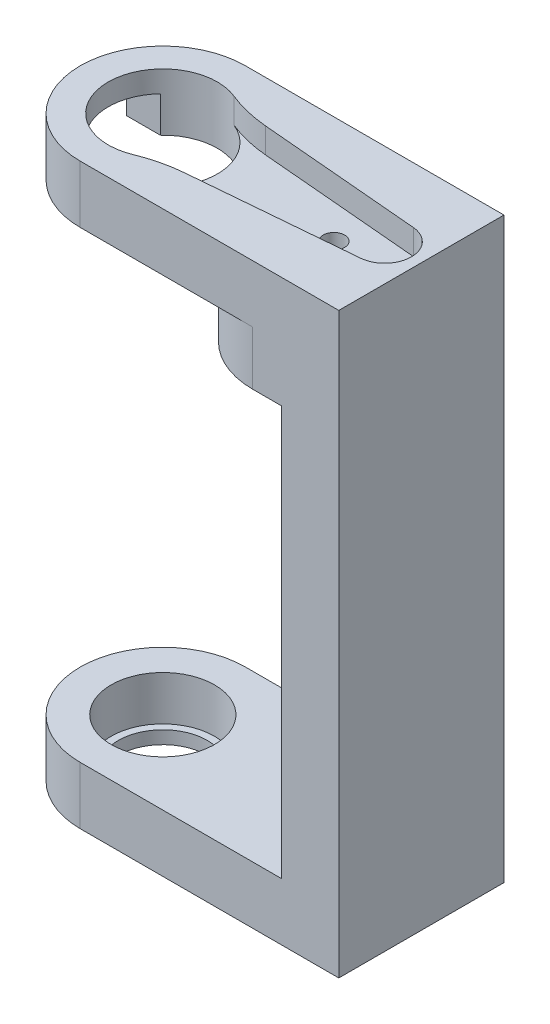
ISO-10303-21;
HEADER;
FILE_DESCRIPTION(('STEP AP214'),'2;1');
FILE_NAME('part.step','',(''),(''),'','','');
FILE_SCHEMA(('AUTOMOTIVE_DESIGN { 1 0 10303 214 1 1 1 1 }'));
ENDSEC;
DATA;
#1=APPLICATION_CONTEXT('core data for automotive mechanical design processes');
#2=APPLICATION_PROTOCOL_DEFINITION('international standard','automotive_design',2000,#1);
#3=PRODUCT_CONTEXT('',#1,'mechanical');
#4=PRODUCT('Part','Part','',(#3));
#5=PRODUCT_RELATED_PRODUCT_CATEGORY('part','',(#4));
#6=PRODUCT_DEFINITION_FORMATION('','',#4);
#7=PRODUCT_DEFINITION_CONTEXT('part definition',#1,'design');
#8=PRODUCT_DEFINITION('design','',#6,#7);
#9=PRODUCT_DEFINITION_SHAPE('','',#8);
#10=(LENGTH_UNIT() NAMED_UNIT(*) SI_UNIT(.MILLI.,.METRE.));
#11=(NAMED_UNIT(*) PLANE_ANGLE_UNIT() SI_UNIT($,.RADIAN.));
#12=(NAMED_UNIT(*) SI_UNIT($,.STERADIAN.) SOLID_ANGLE_UNIT());
#13=UNCERTAINTY_MEASURE_WITH_UNIT(LENGTH_MEASURE(1.E-05),#10,'distance_accuracy_value','');
#14=(GEOMETRIC_REPRESENTATION_CONTEXT(3) GLOBAL_UNCERTAINTY_ASSIGNED_CONTEXT((#13)) GLOBAL_UNIT_ASSIGNED_CONTEXT((#10,
#11,#12)) REPRESENTATION_CONTEXT('',''));
#15=CARTESIAN_POINT('',(0.,0.,0.));
#16=DIRECTION('',(0.,0.,1.));
#17=DIRECTION('',(1.,0.,0.));
#18=AXIS2_PLACEMENT_3D('',#15,#16,#17);
#19=CARTESIAN_POINT('',(0.,-38.5,0.));
#20=DIRECTION('',(0.,1.,0.));
#21=DIRECTION('',(0.,0.,1.));
#22=AXIS2_PLACEMENT_3D('',#19,#20,#21);
#23=CYLINDRICAL_SURFACE('',#22,3.6);
#24=CARTESIAN_POINT('',(0.,-34.5,0.));
#25=DIRECTION('',(0.,-1.,0.));
#26=DIRECTION('',(0.,0.,-1.));
#27=AXIS2_PLACEMENT_3D('',#24,#25,#26);
#28=CIRCLE('',#27,3.6);
#29=CARTESIAN_POINT('',(0.,-34.5,-3.6));
#30=VERTEX_POINT('',#29);
#31=EDGE_CURVE('E226',#30,#30,#28,.T.);
#32=ORIENTED_EDGE('',*,*,#31,.F.);
#33=EDGE_LOOP('',(#32));
#34=FACE_BOUND('',#33,.T.);
#35=CARTESIAN_POINT('',(0.,-37.6,0.));
#36=DIRECTION('',(0.,-1.,0.));
#37=DIRECTION('',(0.,0.,-1.));
#38=AXIS2_PLACEMENT_3D('',#35,#36,#37);
#39=CIRCLE('',#38,3.6);
#40=CARTESIAN_POINT('',(0.,-37.6,-3.6));
#41=VERTEX_POINT('',#40);
#42=EDGE_CURVE('E692',#41,#41,#39,.T.);
#43=ORIENTED_EDGE('',*,*,#42,.T.);
#44=EDGE_LOOP('',(#43));
#45=FACE_BOUND('',#44,.T.);
#46=ADVANCED_FACE('F43',(#34,#45),#23,.F.);
#47=CARTESIAN_POINT('',(12.,-8.,0.));
#48=DIRECTION('',(0.,1.,0.));
#49=DIRECTION('',(0.,0.,1.));
#50=AXIS2_PLACEMENT_3D('',#47,#48,#49);
#51=CYLINDRICAL_SURFACE('',#50,5.75);
#52=DIRECTION('',(0.,-1.,0.));
#53=VECTOR('',#52,1.);
#54=CARTESIAN_POINT('',(12.,-8.,-5.75));
#55=LINE('',#54,#53);
#56=CARTESIAN_POINT('',(12.,-6.,-5.75));
#57=VERTEX_POINT('',#56);
#58=CARTESIAN_POINT('',(12.,-2.25,-5.75));
#59=VERTEX_POINT('',#58);
#60=EDGE_CURVE('E347',#57,#59,#55,.F.);
#61=ORIENTED_EDGE('',*,*,#60,.F.);
#62=CARTESIAN_POINT('',(12.,-6.,0.));
#63=DIRECTION('',(0.,-1.,0.));
#64=DIRECTION('',(0.,0.,-1.));
#65=AXIS2_PLACEMENT_3D('',#62,#63,#64);
#66=CIRCLE('',#65,5.75);
#67=CARTESIAN_POINT('',(12.,-6.,5.75));
#68=VERTEX_POINT('',#67);
#69=EDGE_CURVE('E368',#57,#68,#66,.F.);
#70=ORIENTED_EDGE('',*,*,#69,.T.);
#71=DIRECTION('',(0.,-1.,0.));
#72=VECTOR('',#71,1.);
#73=CARTESIAN_POINT('',(12.,-8.,5.75));
#74=LINE('',#73,#72);
#75=CARTESIAN_POINT('',(12.,-2.25,5.75));
#76=VERTEX_POINT('',#75);
#77=EDGE_CURVE('E349',#76,#68,#74,.T.);
#78=ORIENTED_EDGE('',*,*,#77,.F.);
#79=CARTESIAN_POINT('',(12.,-2.25,0.));
#80=DIRECTION('',(0.,1.,0.));
#81=DIRECTION('',(0.,0.,1.));
#82=AXIS2_PLACEMENT_3D('',#79,#80,#81);
#83=CIRCLE('',#82,5.75);
#84=EDGE_CURVE('E351',#59,#76,#83,.T.);
#85=ORIENTED_EDGE('',*,*,#84,.F.);
#86=EDGE_LOOP('',(#61,#70,#78,#85));
#87=FACE_BOUND('',#86,.T.);
#88=ADVANCED_FACE('F396',(#87),#51,.T.);
#89=CARTESIAN_POINT('',(0.,0.,0.));
#90=DIRECTION('',(0.,1.,0.));
#91=DIRECTION('',(0.,0.,1.));
#92=AXIS2_PLACEMENT_3D('',#89,#90,#91);
#93=PLANE('',#92);
#94=CARTESIAN_POINT('',(11.91,0.,0.));
#95=DIRECTION('',(0.,1.,0.));
#96=DIRECTION('',(0.,0.,1.));
#97=AXIS2_PLACEMENT_3D('',#94,#95,#96);
#98=CIRCLE('',#97,0.75);
#99=CARTESIAN_POINT('',(11.91,0.,0.750000000000001));
#100=VERTEX_POINT('',#99);
#101=EDGE_CURVE('E244',#100,#100,#98,.T.);
#102=ORIENTED_EDGE('',*,*,#101,.F.);
#103=EDGE_LOOP('',(#102));
#104=FACE_BOUND('',#103,.T.);
#105=CARTESIAN_POINT('',(15.4500000000002,0.,0.));
#106=DIRECTION('',(0.,1.,0.));
#107=DIRECTION('',(0.,0.,1.));
#108=AXIS2_PLACEMENT_3D('',#105,#106,#107);
#109=CIRCLE('',#108,1.85);
#110=CARTESIAN_POINT('',(15.6102275035648,0.,1.84304833010455));
#111=VERTEX_POINT('',#110);
#112=CARTESIAN_POINT('',(15.6102275035648,0.,-1.84304833010471));
#113=VERTEX_POINT('',#112);
#114=EDGE_CURVE('E267',#111,#113,#109,.T.);
#115=ORIENTED_EDGE('',*,*,#114,.T.);
#116=DIRECTION('',(-0.996242340597094,0.,-0.0866094613862879));
#117=VECTOR('',#116,1.);
#118=CARTESIAN_POINT('',(0.276121025049715,0.,-3.17613632368286));
#119=LINE('',#118,#117);
#120=CARTESIAN_POINT('',(4.32454293124207,0.,-2.82418215904696));
#121=VERTEX_POINT('',#120);
#122=EDGE_CURVE('E272',#113,#121,#119,.T.);
#123=ORIENTED_EDGE('',*,*,#122,.T.);
#124=CARTESIAN_POINT('',(5.19063754510495,0.,-12.7866055650179));
#125=DIRECTION('',(0.,1.,0.));
#126=DIRECTION('',(0.,0.,1.));
#127=AXIS2_PLACEMENT_3D('',#124,#125,#126);
#128=CIRCLE('',#127,10.);
#129=CARTESIAN_POINT('',(1.42930599068107,0.,-3.52094935848319));
#130=VERTEX_POINT('',#129);
#131=EDGE_CURVE('E335',#121,#130,#128,.F.);
#132=ORIENTED_EDGE('',*,*,#131,.T.);
#133=CARTESIAN_POINT('',(0.,0.,0.));
#134=DIRECTION('',(0.,1.,0.));
#135=DIRECTION('',(0.,0.,1.));
#136=AXIS2_PLACEMENT_3D('',#133,#134,#135);
#137=CIRCLE('',#136,3.8);
#138=CARTESIAN_POINT('',(1.42930599068122,0.,3.52094935848313));
#139=VERTEX_POINT('',#138);
#140=EDGE_CURVE('E310',#139,#130,#137,.T.);
#141=ORIENTED_EDGE('',*,*,#140,.F.);
#142=CARTESIAN_POINT('',(5.19063754510547,0.,12.7866055650177));
#143=DIRECTION('',(0.,1.,0.));
#144=DIRECTION('',(0.,0.,1.));
#145=AXIS2_PLACEMENT_3D('',#142,#143,#144);
#146=CIRCLE('',#145,10.);
#147=CARTESIAN_POINT('',(4.32454293124259,0.,2.82418215904675));
#148=VERTEX_POINT('',#147);
#149=EDGE_CURVE('E333',#139,#148,#146,.F.);
#150=ORIENTED_EDGE('',*,*,#149,.T.);
#151=DIRECTION('',(0.996242340597094,0.,-0.0866094613862878));
#152=VECTOR('',#151,1.);
#153=CARTESIAN_POINT('',(0.276121025049701,0.,3.1761363236827));
#154=LINE('',#153,#152);
#155=EDGE_CURVE('E292',#148,#111,#154,.T.);
#156=ORIENTED_EDGE('',*,*,#155,.T.);
#157=EDGE_LOOP('',(#115,#123,#132,#141,#150,#156));
#158=FACE_BOUND('',#157,.T.);
#159=ADVANCED_FACE('F445',(#104,#158),#93,.T.);
#160=CARTESIAN_POINT('',(0.,-2.25,0.));
#161=DIRECTION('',(0.,1.,0.));
#162=DIRECTION('',(0.,0.,1.));
#163=AXIS2_PLACEMENT_3D('',#160,#161,#162);
#164=PLANE('',#163);
#165=CARTESIAN_POINT('',(0.,-2.25,0.));
#166=DIRECTION('',(0.,1.,0.));
#167=DIRECTION('',(0.,0.,1.));
#168=AXIS2_PLACEMENT_3D('',#165,#166,#167);
#169=CIRCLE('',#168,3.8);
#170=CARTESIAN_POINT('',(-2.7712812921102,-2.25,2.6));
#171=VERTEX_POINT('',#170);
#172=CARTESIAN_POINT('',(-2.7712812921102,-2.25,-2.6));
#173=VERTEX_POINT('',#172);
#174=EDGE_CURVE('E311',#171,#173,#169,.T.);
#175=ORIENTED_EDGE('',*,*,#174,.T.);
#176=DIRECTION('',(1.,0.,0.));
#177=VECTOR('',#176,1.);
#178=CARTESIAN_POINT('',(-5.75,-2.25,-2.6));
#179=LINE('',#178,#177);
#180=CARTESIAN_POINT('',(-5.12859629918363,-2.25,-2.6));
#181=VERTEX_POINT('',#180);
#182=EDGE_CURVE('E252',#181,#173,#179,.T.);
#183=ORIENTED_EDGE('',*,*,#182,.F.);
#184=CARTESIAN_POINT('',(0.,-2.25,0.));
#185=DIRECTION('',(0.,1.,0.));
#186=DIRECTION('',(0.,0.,1.));
#187=AXIS2_PLACEMENT_3D('',#184,#185,#186);
#188=CIRCLE('',#187,5.75);
#189=CARTESIAN_POINT('',(0.,-2.25,-5.75));
#190=VERTEX_POINT('',#189);
#191=EDGE_CURVE('E316',#190,#181,#188,.T.);
#192=ORIENTED_EDGE('',*,*,#191,.F.);
#193=DIRECTION('',(1.,0.,0.));
#194=VECTOR('',#193,1.);
#195=CARTESIAN_POINT('',(0.,-2.25,-5.75));
#196=LINE('',#195,#194);
#197=EDGE_CURVE('E300',#190,#59,#196,.T.);
#198=ORIENTED_EDGE('',*,*,#197,.T.);
#199=ORIENTED_EDGE('',*,*,#84,.T.);
#200=DIRECTION('',(-1.,0.,0.));
#201=VECTOR('',#200,1.);
#202=CARTESIAN_POINT('',(18.,-2.25,5.75));
#203=LINE('',#202,#201);
#204=CARTESIAN_POINT('',(0.,-2.25,5.75));
#205=VERTEX_POINT('',#204);
#206=EDGE_CURVE('E303',#76,#205,#203,.T.);
#207=ORIENTED_EDGE('',*,*,#206,.T.);
#208=CARTESIAN_POINT('',(-5.12859629918363,-2.25,2.6));
#209=VERTEX_POINT('',#208);
#210=EDGE_CURVE('E314',#209,#205,#188,.T.);
#211=ORIENTED_EDGE('',*,*,#210,.F.);
#212=DIRECTION('',(1.,0.,0.));
#213=VECTOR('',#212,1.);
#214=CARTESIAN_POINT('',(-5.75,-2.25,2.6));
#215=LINE('',#214,#213);
#216=EDGE_CURVE('E255',#209,#171,#215,.T.);
#217=ORIENTED_EDGE('',*,*,#216,.T.);
#218=EDGE_LOOP('',(#175,#183,#192,#198,#199,#207,#211,#217));
#219=FACE_BOUND('',#218,.T.);
#220=ADVANCED_FACE('F401',(#219),#164,.F.);
#221=CARTESIAN_POINT('',(0.,-2.25,0.));
#222=DIRECTION('',(0.,1.,0.));
#223=DIRECTION('',(0.,0.,1.));
#224=AXIS2_PLACEMENT_3D('',#221,#222,#223);
#225=CYLINDRICAL_SURFACE('',#224,5.75);
#226=DIRECTION('',(0.,1.,0.));
#227=VECTOR('',#226,1.);
#228=CARTESIAN_POINT('',(-5.12859629918363,-2.25,2.6));
#229=LINE('',#228,#227);
#230=CARTESIAN_POINT('',(-5.12859629918363,0.25,2.6));
#231=VERTEX_POINT('',#230);
#232=EDGE_CURVE('E263',#209,#231,#229,.T.);
#233=ORIENTED_EDGE('',*,*,#232,.F.);
#234=ORIENTED_EDGE('',*,*,#210,.T.);
#235=DIRECTION('',(0.,1.,0.));
#236=VECTOR('',#235,1.);
#237=CARTESIAN_POINT('',(0.,-23.6100093632938,5.75));
#238=LINE('',#237,#236);
#239=CARTESIAN_POINT('',(0.,1.75,5.75));
#240=VERTEX_POINT('',#239);
#241=EDGE_CURVE('E204',#205,#240,#238,.T.);
#242=ORIENTED_EDGE('',*,*,#241,.T.);
#243=CARTESIAN_POINT('',(0.,1.75,0.));
#244=DIRECTION('',(0.,1.,0.));
#245=DIRECTION('',(0.,0.,1.));
#246=AXIS2_PLACEMENT_3D('',#243,#244,#245);
#247=CIRCLE('',#246,5.75);
#248=CARTESIAN_POINT('',(0.,1.75,-5.75));
#249=VERTEX_POINT('',#248);
#250=EDGE_CURVE('E283',#249,#240,#247,.T.);
#251=ORIENTED_EDGE('',*,*,#250,.F.);
#252=DIRECTION('',(0.,1.,0.));
#253=VECTOR('',#252,1.);
#254=CARTESIAN_POINT('',(0.,-23.6100093632938,-5.75));
#255=LINE('',#254,#253);
#256=EDGE_CURVE('E304',#190,#249,#255,.T.);
#257=ORIENTED_EDGE('',*,*,#256,.F.);
#258=ORIENTED_EDGE('',*,*,#191,.T.);
#259=DIRECTION('',(0.,1.,0.));
#260=VECTOR('',#259,1.);
#261=CARTESIAN_POINT('',(-5.12859629918363,-2.25,-2.6));
#262=LINE('',#261,#260);
#263=CARTESIAN_POINT('',(-5.12859629918363,0.250000000000001,-2.6));
#264=VERTEX_POINT('',#263);
#265=EDGE_CURVE('E265',#264,#181,#262,.F.);
#266=ORIENTED_EDGE('',*,*,#265,.F.);
#267=CARTESIAN_POINT('',(0.,0.250000000000001,0.));
#268=DIRECTION('',(0.,1.,0.));
#269=DIRECTION('',(0.,0.,1.));
#270=AXIS2_PLACEMENT_3D('',#267,#268,#269);
#271=CIRCLE('',#270,5.75);
#272=EDGE_CURVE('E254',#231,#264,#271,.F.);
#273=ORIENTED_EDGE('',*,*,#272,.F.);
#274=EDGE_LOOP('',(#233,#234,#242,#251,#257,#258,#266,#273));
#275=FACE_BOUND('',#274,.T.);
#276=ADVANCED_FACE('F406',(#275),#225,.T.);
#277=CARTESIAN_POINT('',(0.,-2.25,0.));
#278=DIRECTION('',(0.,1.,0.));
#279=DIRECTION('',(0.,0.,1.));
#280=AXIS2_PLACEMENT_3D('',#277,#278,#279);
#281=CYLINDRICAL_SURFACE('',#280,3.8);
#282=CARTESIAN_POINT('',(0.,0.250000000000001,0.));
#283=DIRECTION('',(0.,1.,0.));
#284=DIRECTION('',(0.,0.,1.));
#285=AXIS2_PLACEMENT_3D('',#282,#283,#284);
#286=CIRCLE('',#285,3.8);
#287=CARTESIAN_POINT('',(-2.7712812921102,0.25,2.6));
#288=VERTEX_POINT('',#287);
#289=CARTESIAN_POINT('',(-2.7712812921102,0.250000000000001,-2.6));
#290=VERTEX_POINT('',#289);
#291=EDGE_CURVE('E338',#288,#290,#286,.F.);
#292=ORIENTED_EDGE('',*,*,#291,.T.);
#293=DIRECTION('',(0.,1.,0.));
#294=VECTOR('',#293,1.);
#295=CARTESIAN_POINT('',(-2.7712812921102,-2.25,-2.6));
#296=LINE('',#295,#294);
#297=EDGE_CURVE('E344',#290,#173,#296,.F.);
#298=ORIENTED_EDGE('',*,*,#297,.T.);
#299=ORIENTED_EDGE('',*,*,#174,.F.);
#300=DIRECTION('',(0.,1.,0.));
#301=VECTOR('',#300,1.);
#302=CARTESIAN_POINT('',(-2.7712812921102,-2.25,2.6));
#303=LINE('',#302,#301);
#304=EDGE_CURVE('E341',#171,#288,#303,.T.);
#305=ORIENTED_EDGE('',*,*,#304,.T.);
#306=EDGE_LOOP('',(#292,#298,#299,#305));
#307=FACE_BOUND('',#306,.T.);
#308=CARTESIAN_POINT('',(0.,1.75,0.));
#309=DIRECTION('',(0.,1.,0.));
#310=DIRECTION('',(0.,0.,1.));
#311=AXIS2_PLACEMENT_3D('',#308,#309,#310);
#312=CIRCLE('',#311,3.8);
#313=CARTESIAN_POINT('',(1.42930599068122,1.75,3.52094935848313));
#314=VERTEX_POINT('',#313);
#315=CARTESIAN_POINT('',(1.42930599068107,1.75,-3.52094935848319));
#316=VERTEX_POINT('',#315);
#317=EDGE_CURVE('E274',#314,#316,#312,.F.);
#318=ORIENTED_EDGE('',*,*,#317,.F.);
#319=DIRECTION('',(0.,1.,0.));
#320=VECTOR('',#319,1.);
#321=CARTESIAN_POINT('',(1.42930599068122,-2.25,3.52094935848313));
#322=LINE('',#321,#320);
#323=EDGE_CURVE('E321',#314,#139,#322,.F.);
#324=ORIENTED_EDGE('',*,*,#323,.T.);
#325=ORIENTED_EDGE('',*,*,#140,.T.);
#326=DIRECTION('',(0.,1.,0.));
#327=VECTOR('',#326,1.);
#328=CARTESIAN_POINT('',(1.42930599068107,-2.25,-3.52094935848319));
#329=LINE('',#328,#327);
#330=EDGE_CURVE('E319',#130,#316,#329,.T.);
#331=ORIENTED_EDGE('',*,*,#330,.T.);
#332=EDGE_LOOP('',(#318,#324,#325,#331));
#333=FACE_BOUND('',#332,.T.);
#334=ADVANCED_FACE('F416',(#307,#333),#281,.F.);
#335=CARTESIAN_POINT('',(0.,-23.6100093632938,-5.75));
#336=DIRECTION('',(0.,0.,-1.));
#337=DIRECTION('',(-1.,0.,0.));
#338=AXIS2_PLACEMENT_3D('',#335,#336,#337);
#339=PLANE('',#338);
#340=DIRECTION('',(0.,-1.,0.));
#341=VECTOR('',#340,1.);
#342=CARTESIAN_POINT('',(14.,-4.,-5.75));
#343=LINE('',#342,#341);
#344=CARTESIAN_POINT('',(14.,-6.,-5.75));
#345=VERTEX_POINT('',#344);
#346=CARTESIAN_POINT('',(14.,-34.5,-5.75));
#347=VERTEX_POINT('',#346);
#348=EDGE_CURVE('E61',#345,#347,#343,.T.);
#349=ORIENTED_EDGE('',*,*,#348,.F.);
#350=DIRECTION('',(-1.,0.,0.));
#351=VECTOR('',#350,1.);
#352=CARTESIAN_POINT('',(0.,-6.,-5.75));
#353=LINE('',#352,#351);
#354=EDGE_CURVE('E65',#345,#57,#353,.T.);
#355=ORIENTED_EDGE('',*,*,#354,.T.);
#356=ORIENTED_EDGE('',*,*,#60,.T.);
#357=ORIENTED_EDGE('',*,*,#197,.F.);
#358=ORIENTED_EDGE('',*,*,#256,.T.);
#359=DIRECTION('',(-1.,0.,0.));
#360=VECTOR('',#359,1.);
#361=CARTESIAN_POINT('',(0.,1.75,-5.75));
#362=LINE('',#361,#360);
#363=CARTESIAN_POINT('',(18.,1.75,-5.75));
#364=VERTEX_POINT('',#363);
#365=EDGE_CURVE('E280',#364,#249,#362,.T.);
#366=ORIENTED_EDGE('',*,*,#365,.F.);
#367=DIRECTION('',(0.,1.,0.));
#368=VECTOR('',#367,1.);
#369=CARTESIAN_POINT('',(18.,-23.6100093632938,-5.75));
#370=LINE('',#369,#368);
#371=CARTESIAN_POINT('',(18.,-38.5,-5.75));
#372=VERTEX_POINT('',#371);
#373=EDGE_CURVE('E203',#372,#364,#370,.T.);
#374=ORIENTED_EDGE('',*,*,#373,.F.);
#375=DIRECTION('',(1.,0.,0.));
#376=VECTOR('',#375,1.);
#377=CARTESIAN_POINT('',(0.,-38.5,-5.75));
#378=LINE('',#377,#376);
#379=CARTESIAN_POINT('',(0.,-38.5,-5.75));
#380=VERTEX_POINT('',#379);
#381=EDGE_CURVE('E220',#380,#372,#378,.T.);
#382=ORIENTED_EDGE('',*,*,#381,.F.);
#383=DIRECTION('',(0.,1.,0.));
#384=VECTOR('',#383,1.);
#385=CARTESIAN_POINT('',(0.,-38.5,-5.75));
#386=LINE('',#385,#384);
#387=CARTESIAN_POINT('',(0.,-34.5,-5.75));
#388=VERTEX_POINT('',#387);
#389=EDGE_CURVE('E231',#380,#388,#386,.T.);
#390=ORIENTED_EDGE('',*,*,#389,.T.);
#391=DIRECTION('',(1.,0.,0.));
#392=VECTOR('',#391,1.);
#393=CARTESIAN_POINT('',(0.,-34.5,-5.75));
#394=LINE('',#393,#392);
#395=EDGE_CURVE('E221',#388,#347,#394,.T.);
#396=ORIENTED_EDGE('',*,*,#395,.T.);
#397=EDGE_LOOP('',(#349,#355,#356,#357,#358,#366,#374,#382,#390,#396));
#398=FACE_BOUND('',#397,.T.);
#399=ADVANCED_FACE('F397',(#398),#339,.T.);
#400=CARTESIAN_POINT('',(18.,-23.6100093632938,-5.75));
#401=DIRECTION('',(1.,0.,0.));
#402=DIRECTION('',(0.,0.,-1.));
#403=AXIS2_PLACEMENT_3D('',#400,#401,#402);
#404=PLANE('',#403);
#405=ORIENTED_EDGE('',*,*,#373,.T.);
#406=DIRECTION('',(0.,0.,-1.));
#407=VECTOR('',#406,1.);
#408=CARTESIAN_POINT('',(18.,1.75,0.));
#409=LINE('',#408,#407);
#410=CARTESIAN_POINT('',(18.,1.75,5.75));
#411=VERTEX_POINT('',#410);
#412=EDGE_CURVE('E199',#411,#364,#409,.T.);
#413=ORIENTED_EDGE('',*,*,#412,.F.);
#414=DIRECTION('',(0.,1.,0.));
#415=VECTOR('',#414,1.);
#416=CARTESIAN_POINT('',(18.,-23.6100093632938,5.75));
#417=LINE('',#416,#415);
#418=CARTESIAN_POINT('',(18.,-38.5,5.75));
#419=VERTEX_POINT('',#418);
#420=EDGE_CURVE('E193',#419,#411,#417,.T.);
#421=ORIENTED_EDGE('',*,*,#420,.F.);
#422=DIRECTION('',(0.,0.,1.));
#423=VECTOR('',#422,1.);
#424=CARTESIAN_POINT('',(18.,-38.5,5.75));
#425=LINE('',#424,#423);
#426=EDGE_CURVE('E197',#372,#419,#425,.T.);
#427=ORIENTED_EDGE('',*,*,#426,.F.);
#428=EDGE_LOOP('',(#405,#413,#421,#427));
#429=FACE_BOUND('',#428,.T.);
#430=ADVANCED_FACE('F195',(#429),#404,.T.);
#431=CARTESIAN_POINT('',(18.,-23.6100093632938,5.75));
#432=DIRECTION('',(0.,0.,1.));
#433=DIRECTION('',(1.,0.,0.));
#434=AXIS2_PLACEMENT_3D('',#431,#432,#433);
#435=PLANE('',#434);
#436=ORIENTED_EDGE('',*,*,#77,.T.);
#437=DIRECTION('',(1.,0.,0.));
#438=VECTOR('',#437,1.);
#439=CARTESIAN_POINT('',(18.,-6.,5.75));
#440=LINE('',#439,#438);
#441=CARTESIAN_POINT('',(14.,-6.,5.75));
#442=VERTEX_POINT('',#441);
#443=EDGE_CURVE('E364',#68,#442,#440,.T.);
#444=ORIENTED_EDGE('',*,*,#443,.T.);
#445=DIRECTION('',(0.,-1.,0.));
#446=VECTOR('',#445,1.);
#447=CARTESIAN_POINT('',(14.,-4.,5.75));
#448=LINE('',#447,#446);
#449=CARTESIAN_POINT('',(14.,-34.5,5.75));
#450=VERTEX_POINT('',#449);
#451=EDGE_CURVE('E242',#442,#450,#448,.T.);
#452=ORIENTED_EDGE('',*,*,#451,.T.);
#453=DIRECTION('',(-1.,0.,0.));
#454=VECTOR('',#453,1.);
#455=CARTESIAN_POINT('',(18.,-34.5,5.75));
#456=LINE('',#455,#454);
#457=CARTESIAN_POINT('',(0.,-34.5,5.75));
#458=VERTEX_POINT('',#457);
#459=EDGE_CURVE('E232',#450,#458,#456,.T.);
#460=ORIENTED_EDGE('',*,*,#459,.T.);
#461=DIRECTION('',(0.,1.,0.));
#462=VECTOR('',#461,1.);
#463=CARTESIAN_POINT('',(0.,-38.5,5.75));
#464=LINE('',#463,#462);
#465=CARTESIAN_POINT('',(0.,-38.5,5.75));
#466=VERTEX_POINT('',#465);
#467=EDGE_CURVE('E211',#466,#458,#464,.T.);
#468=ORIENTED_EDGE('',*,*,#467,.F.);
#469=DIRECTION('',(-1.,0.,0.));
#470=VECTOR('',#469,1.);
#471=CARTESIAN_POINT('',(18.,-38.5,5.75));
#472=LINE('',#471,#470);
#473=EDGE_CURVE('E207',#419,#466,#472,.T.);
#474=ORIENTED_EDGE('',*,*,#473,.F.);
#475=ORIENTED_EDGE('',*,*,#420,.T.);
#476=DIRECTION('',(1.,0.,0.));
#477=VECTOR('',#476,1.);
#478=CARTESIAN_POINT('',(0.,1.75,5.75));
#479=LINE('',#478,#477);
#480=EDGE_CURVE('E286',#240,#411,#479,.T.);
#481=ORIENTED_EDGE('',*,*,#480,.F.);
#482=ORIENTED_EDGE('',*,*,#241,.F.);
#483=ORIENTED_EDGE('',*,*,#206,.F.);
#484=EDGE_LOOP('',(#436,#444,#452,#460,#468,#474,#475,#481,#482,#483));
#485=FACE_BOUND('',#484,.T.);
#486=ADVANCED_FACE('F209',(#485),#435,.T.);
#487=CARTESIAN_POINT('',(0.,-8.,0.));
#488=DIRECTION('',(0.,-1.,0.));
#489=DIRECTION('',(0.,0.,-1.));
#490=AXIS2_PLACEMENT_3D('',#487,#488,#489);
#491=PLANE('',#490);
#492=DIRECTION('',(0.,0.,-1.));
#493=VECTOR('',#492,1.);
#494=CARTESIAN_POINT('',(14.,-8.,0.));
#495=LINE('',#494,#493);
#496=CARTESIAN_POINT('',(14.,-8.,3.75000000000001));
#497=VERTEX_POINT('',#496);
#498=CARTESIAN_POINT('',(14.,-8.,-3.75000000000001));
#499=VERTEX_POINT('',#498);
#500=EDGE_CURVE('E354',#497,#499,#495,.T.);
#501=ORIENTED_EDGE('',*,*,#500,.F.);
#502=DIRECTION('',(-1.,0.,0.));
#503=VECTOR('',#502,1.);
#504=CARTESIAN_POINT('',(0.,-8.,3.75000000000001));
#505=LINE('',#504,#503);
#506=CARTESIAN_POINT('',(12.,-8.,3.75000000000001));
#507=VERTEX_POINT('',#506);
#508=EDGE_CURVE('E361',#497,#507,#505,.T.);
#509=ORIENTED_EDGE('',*,*,#508,.T.);
#510=CARTESIAN_POINT('',(12.,-8.,0.));
#511=DIRECTION('',(0.,-1.,0.));
#512=DIRECTION('',(0.,0.,-1.));
#513=AXIS2_PLACEMENT_3D('',#510,#511,#512);
#514=CIRCLE('',#513,3.75000000000001);
#515=CARTESIAN_POINT('',(12.,-8.,-3.75000000000001));
#516=VERTEX_POINT('',#515);
#517=EDGE_CURVE('E357',#507,#516,#514,.T.);
#518=ORIENTED_EDGE('',*,*,#517,.T.);
#519=DIRECTION('',(1.,0.,0.));
#520=VECTOR('',#519,1.);
#521=CARTESIAN_POINT('',(0.,-8.,-3.75000000000001));
#522=LINE('',#521,#520);
#523=EDGE_CURVE('E359',#516,#499,#522,.T.);
#524=ORIENTED_EDGE('',*,*,#523,.T.);
#525=EDGE_LOOP('',(#501,#509,#518,#524));
#526=FACE_BOUND('',#525,.T.);
#527=CARTESIAN_POINT('',(11.91,-8.,0.));
#528=DIRECTION('',(0.,1.,0.));
#529=DIRECTION('',(0.,0.,1.));
#530=AXIS2_PLACEMENT_3D('',#527,#528,#529);
#531=CIRCLE('',#530,0.75);
#532=CARTESIAN_POINT('',(11.91,-8.,0.750000000000001));
#533=VERTEX_POINT('',#532);
#534=EDGE_CURVE('E246',#533,#533,#531,.T.);
#535=ORIENTED_EDGE('',*,*,#534,.T.);
#536=EDGE_LOOP('',(#535));
#537=FACE_BOUND('',#536,.T.);
#538=ADVANCED_FACE('F385',(#526,#537),#491,.T.);
#539=CARTESIAN_POINT('',(15.4500000000002,1.75,0.));
#540=DIRECTION('',(0.,-1.,0.));
#541=DIRECTION('',(0.,0.,-1.));
#542=AXIS2_PLACEMENT_3D('',#539,#540,#541);
#543=CYLINDRICAL_SURFACE('',#542,1.85);
#544=ORIENTED_EDGE('',*,*,#114,.F.);
#545=DIRECTION('',(0.,-1.,0.));
#546=VECTOR('',#545,1.);
#547=CARTESIAN_POINT('',(15.6102275035648,1.75,1.84304833010455));
#548=LINE('',#547,#546);
#549=CARTESIAN_POINT('',(15.6102275035648,1.75,1.84304833010455));
#550=VERTEX_POINT('',#549);
#551=EDGE_CURVE('E297',#550,#111,#548,.T.);
#552=ORIENTED_EDGE('',*,*,#551,.F.);
#553=CARTESIAN_POINT('',(15.4500000000002,1.75,0.));
#554=DIRECTION('',(0.,1.,0.));
#555=DIRECTION('',(0.,0.,1.));
#556=AXIS2_PLACEMENT_3D('',#553,#554,#555);
#557=CIRCLE('',#556,1.85);
#558=CARTESIAN_POINT('',(15.6102275035648,1.75,-1.84304833010471));
#559=VERTEX_POINT('',#558);
#560=EDGE_CURVE('E268',#550,#559,#557,.T.);
#561=ORIENTED_EDGE('',*,*,#560,.T.);
#562=DIRECTION('',(0.,-1.,0.));
#563=VECTOR('',#562,1.);
#564=CARTESIAN_POINT('',(15.6102275035648,1.75,-1.84304833010471));
#565=LINE('',#564,#563);
#566=EDGE_CURVE('E289',#559,#113,#565,.T.);
#567=ORIENTED_EDGE('',*,*,#566,.T.);
#568=EDGE_LOOP('',(#544,#552,#561,#567));
#569=FACE_BOUND('',#568,.T.);
#570=ADVANCED_FACE('F479',(#569),#543,.F.);
#571=CARTESIAN_POINT('',(0.276121025049701,1.75,3.1761363236827));
#572=DIRECTION('',(-0.0866094613862879,0.,-0.996242340597095));
#573=DIRECTION('',(-0.996242340597095,0.,0.0866094613862879));
#574=AXIS2_PLACEMENT_3D('',#571,#572,#573);
#575=PLANE('',#574);
#576=ORIENTED_EDGE('',*,*,#155,.F.);
#577=DIRECTION('',(0.,-1.,0.));
#578=VECTOR('',#577,1.);
#579=CARTESIAN_POINT('',(4.32454293124259,1.75,2.82418215904675));
#580=LINE('',#579,#578);
#581=CARTESIAN_POINT('',(4.32454293124259,1.75,2.82418215904675));
#582=VERTEX_POINT('',#581);
#583=EDGE_CURVE('E324',#148,#582,#580,.F.);
#584=ORIENTED_EDGE('',*,*,#583,.T.);
#585=DIRECTION('',(0.996242340597094,0.,-0.0866094613862878));
#586=VECTOR('',#585,1.);
#587=CARTESIAN_POINT('',(0.276121025049701,1.75,3.1761363236827));
#588=LINE('',#587,#586);
#589=EDGE_CURVE('E271',#582,#550,#588,.T.);
#590=ORIENTED_EDGE('',*,*,#589,.T.);
#591=ORIENTED_EDGE('',*,*,#551,.T.);
#592=EDGE_LOOP('',(#576,#584,#590,#591));
#593=FACE_BOUND('',#592,.T.);
#594=ADVANCED_FACE('F482',(#593),#575,.T.);
#595=CARTESIAN_POINT('',(0.276121025049715,1.75,-3.17613632368286));
#596=DIRECTION('',(-0.0866094613862879,0.,0.996242340597095));
#597=DIRECTION('',(0.996242340597095,0.,0.0866094613862879));
#598=AXIS2_PLACEMENT_3D('',#595,#596,#597);
#599=PLANE('',#598);
#600=DIRECTION('',(-0.996242340597094,0.,-0.0866094613862879));
#601=VECTOR('',#600,1.);
#602=CARTESIAN_POINT('',(0.276121025049715,1.75,-3.17613632368286));
#603=LINE('',#602,#601);
#604=CARTESIAN_POINT('',(4.32454293124207,1.75,-2.82418215904696));
#605=VERTEX_POINT('',#604);
#606=EDGE_CURVE('E277',#559,#605,#603,.T.);
#607=ORIENTED_EDGE('',*,*,#606,.T.);
#608=DIRECTION('',(0.,-1.,0.));
#609=VECTOR('',#608,1.);
#610=CARTESIAN_POINT('',(4.32454293124207,0.,-2.82418215904696));
#611=LINE('',#610,#609);
#612=EDGE_CURVE('E330',#605,#121,#611,.T.);
#613=ORIENTED_EDGE('',*,*,#612,.T.);
#614=ORIENTED_EDGE('',*,*,#122,.F.);
#615=ORIENTED_EDGE('',*,*,#566,.F.);
#616=EDGE_LOOP('',(#607,#613,#614,#615));
#617=FACE_BOUND('',#616,.T.);
#618=ADVANCED_FACE('F498',(#617),#599,.T.);
#619=CARTESIAN_POINT('',(0.,1.75,0.));
#620=DIRECTION('',(0.,1.,0.));
#621=DIRECTION('',(0.,0.,1.));
#622=AXIS2_PLACEMENT_3D('',#619,#620,#621);
#623=PLANE('',#622);
#624=ORIENTED_EDGE('',*,*,#589,.F.);
#625=CARTESIAN_POINT('',(5.19063754510547,1.75,12.7866055650177));
#626=DIRECTION('',(0.,1.,0.));
#627=DIRECTION('',(0.,0.,1.));
#628=AXIS2_PLACEMENT_3D('',#625,#626,#627);
#629=CIRCLE('',#628,10.);
#630=EDGE_CURVE('E328',#582,#314,#629,.T.);
#631=ORIENTED_EDGE('',*,*,#630,.T.);
#632=ORIENTED_EDGE('',*,*,#317,.T.);
#633=CARTESIAN_POINT('',(5.19063754510495,1.75,-12.7866055650179));
#634=DIRECTION('',(0.,1.,0.));
#635=DIRECTION('',(0.,0.,1.));
#636=AXIS2_PLACEMENT_3D('',#633,#634,#635);
#637=CIRCLE('',#636,10.);
#638=EDGE_CURVE('E326',#316,#605,#637,.T.);
#639=ORIENTED_EDGE('',*,*,#638,.T.);
#640=ORIENTED_EDGE('',*,*,#606,.F.);
#641=ORIENTED_EDGE('',*,*,#560,.F.);
#642=EDGE_LOOP('',(#624,#631,#632,#639,#640,#641));
#643=FACE_BOUND('',#642,.T.);
#644=ORIENTED_EDGE('',*,*,#365,.T.);
#645=ORIENTED_EDGE('',*,*,#250,.T.);
#646=ORIENTED_EDGE('',*,*,#480,.T.);
#647=ORIENTED_EDGE('',*,*,#412,.T.);
#648=EDGE_LOOP('',(#644,#645,#646,#647));
#649=FACE_BOUND('',#648,.T.);
#650=ADVANCED_FACE('F411',(#643,#649),#623,.T.);
#651=CARTESIAN_POINT('',(5.19063754510547,-2.25,12.7866055650177));
#652=DIRECTION('',(0.,1.,0.));
#653=DIRECTION('',(0.,0.,1.));
#654=AXIS2_PLACEMENT_3D('',#651,#652,#653);
#655=CYLINDRICAL_SURFACE('',#654,10.);
#656=ORIENTED_EDGE('',*,*,#630,.F.);
#657=ORIENTED_EDGE('',*,*,#583,.F.);
#658=ORIENTED_EDGE('',*,*,#149,.F.);
#659=ORIENTED_EDGE('',*,*,#323,.F.);
#660=EDGE_LOOP('',(#656,#657,#658,#659));
#661=FACE_BOUND('',#660,.T.);
#662=ADVANCED_FACE('F491',(#661),#655,.T.);
#663=CARTESIAN_POINT('',(5.19063754510495,-2.25,-12.7866055650179));
#664=DIRECTION('',(0.,1.,0.));
#665=DIRECTION('',(0.,0.,1.));
#666=AXIS2_PLACEMENT_3D('',#663,#664,#665);
#667=CYLINDRICAL_SURFACE('',#666,10.);
#668=ORIENTED_EDGE('',*,*,#638,.F.);
#669=ORIENTED_EDGE('',*,*,#330,.F.);
#670=ORIENTED_EDGE('',*,*,#131,.F.);
#671=ORIENTED_EDGE('',*,*,#612,.F.);
#672=EDGE_LOOP('',(#668,#669,#670,#671));
#673=FACE_BOUND('',#672,.T.);
#674=ADVANCED_FACE('F434',(#673),#667,.T.);
#675=CARTESIAN_POINT('',(-5.75,0.250000000000001,-2.6));
#676=DIRECTION('',(0.,0.,-1.));
#677=DIRECTION('',(0.,1.,0.));
#678=AXIS2_PLACEMENT_3D('',#675,#676,#677);
#679=PLANE('',#678);
#680=ORIENTED_EDGE('',*,*,#265,.T.);
#681=ORIENTED_EDGE('',*,*,#182,.T.);
#682=ORIENTED_EDGE('',*,*,#297,.F.);
#683=DIRECTION('',(1.,0.,0.));
#684=VECTOR('',#683,1.);
#685=CARTESIAN_POINT('',(-5.75,0.250000000000001,-2.6));
#686=LINE('',#685,#684);
#687=EDGE_CURVE('E249',#264,#290,#686,.T.);
#688=ORIENTED_EDGE('',*,*,#687,.F.);
#689=EDGE_LOOP('',(#680,#681,#682,#688));
#690=FACE_BOUND('',#689,.T.);
#691=ADVANCED_FACE('F421',(#690),#679,.F.);
#692=CARTESIAN_POINT('',(-5.75,-2.25,2.6));
#693=DIRECTION('',(0.,0.,1.));
#694=DIRECTION('',(1.,0.,0.));
#695=AXIS2_PLACEMENT_3D('',#692,#693,#694);
#696=PLANE('',#695);
#697=ORIENTED_EDGE('',*,*,#232,.T.);
#698=DIRECTION('',(1.,0.,0.));
#699=VECTOR('',#698,1.);
#700=CARTESIAN_POINT('',(-5.75,0.25,2.6));
#701=LINE('',#700,#699);
#702=EDGE_CURVE('E258',#231,#288,#701,.T.);
#703=ORIENTED_EDGE('',*,*,#702,.T.);
#704=ORIENTED_EDGE('',*,*,#304,.F.);
#705=ORIENTED_EDGE('',*,*,#216,.F.);
#706=EDGE_LOOP('',(#697,#703,#704,#705));
#707=FACE_BOUND('',#706,.T.);
#708=ADVANCED_FACE('F425',(#707),#696,.F.);
#709=CARTESIAN_POINT('',(-5.75,0.250000000000001,-2.6));
#710=DIRECTION('',(0.,1.,0.));
#711=DIRECTION('',(0.,0.,1.));
#712=AXIS2_PLACEMENT_3D('',#709,#710,#711);
#713=PLANE('',#712);
#714=ORIENTED_EDGE('',*,*,#272,.T.);
#715=ORIENTED_EDGE('',*,*,#687,.T.);
#716=ORIENTED_EDGE('',*,*,#291,.F.);
#717=ORIENTED_EDGE('',*,*,#702,.F.);
#718=EDGE_LOOP('',(#714,#715,#716,#717));
#719=FACE_BOUND('',#718,.T.);
#720=ADVANCED_FACE('F423',(#719),#713,.F.);
#721=CARTESIAN_POINT('',(11.91,-8.,0.));
#722=DIRECTION('',(0.,1.,0.));
#723=DIRECTION('',(0.,0.,1.));
#724=AXIS2_PLACEMENT_3D('',#721,#722,#723);
#725=CYLINDRICAL_SURFACE('',#724,0.75);
#726=ORIENTED_EDGE('',*,*,#534,.F.);
#727=EDGE_LOOP('',(#726));
#728=FACE_BOUND('',#727,.T.);
#729=ORIENTED_EDGE('',*,*,#101,.T.);
#730=EDGE_LOOP('',(#729));
#731=FACE_BOUND('',#730,.T.);
#732=ADVANCED_FACE('F432',(#728,#731),#725,.F.);
#733=CARTESIAN_POINT('',(14.,-4.,5.75));
#734=DIRECTION('',(-1.,0.,0.));
#735=DIRECTION('',(0.,0.,1.));
#736=AXIS2_PLACEMENT_3D('',#733,#734,#735);
#737=PLANE('',#736);
#738=ORIENTED_EDGE('',*,*,#451,.F.);
#739=DIRECTION('',(0.,0.70710678118655,0.707106781186546));
#740=VECTOR('',#739,1.);
#741=CARTESIAN_POINT('',(14.,-8.,3.75000000000001));
#742=LINE('',#741,#740);
#743=EDGE_CURVE('E53',#442,#497,#742,.F.);
#744=ORIENTED_EDGE('',*,*,#743,.T.);
#745=ORIENTED_EDGE('',*,*,#500,.T.);
#746=DIRECTION('',(0.,-0.70710678118655,0.707106781186546));
#747=VECTOR('',#746,1.);
#748=CARTESIAN_POINT('',(14.,-6.,-5.75));
#749=LINE('',#748,#747);
#750=EDGE_CURVE('E11',#499,#345,#749,.F.);
#751=ORIENTED_EDGE('',*,*,#750,.T.);
#752=ORIENTED_EDGE('',*,*,#348,.T.);
#753=DIRECTION('',(0.,0.,-1.));
#754=VECTOR('',#753,1.);
#755=CARTESIAN_POINT('',(14.,-34.5,5.75));
#756=LINE('',#755,#754);
#757=EDGE_CURVE('E239',#450,#347,#756,.T.);
#758=ORIENTED_EDGE('',*,*,#757,.F.);
#759=EDGE_LOOP('',(#738,#744,#745,#751,#752,#758));
#760=FACE_BOUND('',#759,.T.);
#761=ADVANCED_FACE('F388',(#760),#737,.T.);
#762=CARTESIAN_POINT('',(0.,-6.,-5.75));
#763=DIRECTION('',(0.,0.707106781186545,0.707106781186549));
#764=DIRECTION('',(-1.,0.,0.));
#765=AXIS2_PLACEMENT_3D('',#762,#763,#764);
#766=PLANE('',#765);
#767=ORIENTED_EDGE('',*,*,#750,.F.);
#768=ORIENTED_EDGE('',*,*,#523,.F.);
#769=DIRECTION('',(0.,-0.707106781186549,0.707106781186545));
#770=VECTOR('',#769,1.);
#771=CARTESIAN_POINT('',(12.,-6.,-5.75));
#772=LINE('',#771,#770);
#773=EDGE_CURVE('E48',#57,#516,#772,.T.);
#774=ORIENTED_EDGE('',*,*,#773,.F.);
#775=ORIENTED_EDGE('',*,*,#354,.F.);
#776=EDGE_LOOP('',(#767,#768,#774,#775));
#777=FACE_BOUND('',#776,.T.);
#778=ADVANCED_FACE('F46',(#777),#766,.F.);
#779=CARTESIAN_POINT('',(12.,-8.,0.));
#780=DIRECTION('',(0.,1.,0.));
#781=DIRECTION('',(0.,0.,1.));
#782=AXIS2_PLACEMENT_3D('',#779,#780,#781);
#783=CONICAL_SURFACE('',#782,3.75000000000001,0.785398163397445);
#784=ORIENTED_EDGE('',*,*,#773,.T.);
#785=ORIENTED_EDGE('',*,*,#517,.F.);
#786=DIRECTION('',(0.,-0.70710678118655,-0.707106781186545));
#787=VECTOR('',#786,1.);
#788=CARTESIAN_POINT('',(12.,-6.,5.75));
#789=LINE('',#788,#787);
#790=EDGE_CURVE('E238',#68,#507,#789,.T.);
#791=ORIENTED_EDGE('',*,*,#790,.F.);
#792=ORIENTED_EDGE('',*,*,#69,.F.);
#793=EDGE_LOOP('',(#784,#785,#791,#792));
#794=FACE_BOUND('',#793,.T.);
#795=ADVANCED_FACE('F379',(#794),#783,.T.);
#796=CARTESIAN_POINT('',(0.,-8.,3.75000000000001));
#797=DIRECTION('',(0.,0.707106781186545,-0.707106781186549));
#798=DIRECTION('',(-1.,0.,0.));
#799=AXIS2_PLACEMENT_3D('',#796,#797,#798);
#800=PLANE('',#799);
#801=ORIENTED_EDGE('',*,*,#743,.F.);
#802=ORIENTED_EDGE('',*,*,#443,.F.);
#803=ORIENTED_EDGE('',*,*,#790,.T.);
#804=ORIENTED_EDGE('',*,*,#508,.F.);
#805=EDGE_LOOP('',(#801,#802,#803,#804));
#806=FACE_BOUND('',#805,.T.);
#807=ADVANCED_FACE('F391',(#806),#800,.F.);
#808=CARTESIAN_POINT('',(0.,-34.5,0.));
#809=DIRECTION('',(0.,-1.,0.));
#810=DIRECTION('',(0.,0.,-1.));
#811=AXIS2_PLACEMENT_3D('',#808,#809,#810);
#812=PLANE('',#811);
#813=ORIENTED_EDGE('',*,*,#31,.T.);
#814=EDGE_LOOP('',(#813));
#815=FACE_BOUND('',#814,.T.);
#816=ORIENTED_EDGE('',*,*,#459,.F.);
#817=ORIENTED_EDGE('',*,*,#757,.T.);
#818=ORIENTED_EDGE('',*,*,#395,.F.);
#819=CARTESIAN_POINT('',(0.,-34.5,0.));
#820=DIRECTION('',(0.,-1.,0.));
#821=DIRECTION('',(0.,0.,-1.));
#822=AXIS2_PLACEMENT_3D('',#819,#820,#821);
#823=CIRCLE('',#822,5.75);
#824=EDGE_CURVE('E223',#458,#388,#823,.T.);
#825=ORIENTED_EDGE('',*,*,#824,.F.);
#826=EDGE_LOOP('',(#816,#817,#818,#825));
#827=FACE_BOUND('',#826,.T.);
#828=ADVANCED_FACE('F455',(#815,#827),#812,.F.);
#829=CARTESIAN_POINT('',(0.,-38.5,0.));
#830=DIRECTION('',(0.,-1.,0.));
#831=DIRECTION('',(0.,0.,-1.));
#832=AXIS2_PLACEMENT_3D('',#829,#830,#831);
#833=PLANE('',#832);
#834=ORIENTED_EDGE('',*,*,#426,.T.);
#835=ORIENTED_EDGE('',*,*,#473,.T.);
#836=CARTESIAN_POINT('',(0.,-38.5,0.));
#837=DIRECTION('',(0.,-1.,0.));
#838=DIRECTION('',(0.,0.,-1.));
#839=AXIS2_PLACEMENT_3D('',#836,#837,#838);
#840=CIRCLE('',#839,5.75);
#841=EDGE_CURVE('E214',#466,#380,#840,.T.);
#842=ORIENTED_EDGE('',*,*,#841,.T.);
#843=ORIENTED_EDGE('',*,*,#381,.T.);
#844=EDGE_LOOP('',(#834,#835,#842,#843));
#845=FACE_BOUND('',#844,.T.);
#846=CARTESIAN_POINT('',(0.,-38.5,0.));
#847=DIRECTION('',(0.,-1.,0.));
#848=DIRECTION('',(0.,0.,-1.));
#849=AXIS2_PLACEMENT_3D('',#846,#847,#848);
#850=CIRCLE('',#849,3.1);
#851=CARTESIAN_POINT('',(0.,-38.5,-3.1));
#852=VERTEX_POINT('',#851);
#853=EDGE_CURVE('E690',#852,#852,#850,.T.);
#854=ORIENTED_EDGE('',*,*,#853,.F.);
#855=EDGE_LOOP('',(#854));
#856=FACE_BOUND('',#855,.T.);
#857=ADVANCED_FACE('F217',(#845,#856),#833,.T.);
#858=CARTESIAN_POINT('',(0.,-38.5,0.));
#859=DIRECTION('',(0.,1.,0.));
#860=DIRECTION('',(0.,0.,1.));
#861=AXIS2_PLACEMENT_3D('',#858,#859,#860);
#862=CYLINDRICAL_SURFACE('',#861,5.75);
#863=ORIENTED_EDGE('',*,*,#824,.T.);
#864=ORIENTED_EDGE('',*,*,#389,.F.);
#865=ORIENTED_EDGE('',*,*,#841,.F.);
#866=ORIENTED_EDGE('',*,*,#467,.T.);
#867=EDGE_LOOP('',(#863,#864,#865,#866));
#868=FACE_BOUND('',#867,.T.);
#869=ADVANCED_FACE('F454',(#868),#862,.T.);
#870=CARTESIAN_POINT('',(0.,-37.6,0.));
#871=DIRECTION('',(0.,-1.,0.));
#872=DIRECTION('',(0.,0.,-1.));
#873=AXIS2_PLACEMENT_3D('',#870,#871,#872);
#874=PLANE('',#873);
#875=CARTESIAN_POINT('',(0.,-37.6,0.));
#876=DIRECTION('',(0.,-1.,0.));
#877=DIRECTION('',(0.,0.,-1.));
#878=AXIS2_PLACEMENT_3D('',#875,#876,#877);
#879=CIRCLE('',#878,3.1);
#880=CARTESIAN_POINT('',(0.,-37.6,-3.1));
#881=VERTEX_POINT('',#880);
#882=EDGE_CURVE('E687',#881,#881,#879,.T.);
#883=ORIENTED_EDGE('',*,*,#882,.T.);
#884=EDGE_LOOP('',(#883));
#885=FACE_BOUND('',#884,.T.);
#886=ORIENTED_EDGE('',*,*,#42,.F.);
#887=EDGE_LOOP('',(#886));
#888=FACE_BOUND('',#887,.T.);
#889=ADVANCED_FACE('F451',(#885,#888),#874,.F.);
#890=CARTESIAN_POINT('',(0.,-37.6,0.));
#891=DIRECTION('',(0.,-1.,0.));
#892=DIRECTION('',(0.,0.,-1.));
#893=AXIS2_PLACEMENT_3D('',#890,#891,#892);
#894=CYLINDRICAL_SURFACE('',#893,3.1);
#895=ORIENTED_EDGE('',*,*,#882,.F.);
#896=EDGE_LOOP('',(#895));
#897=FACE_BOUND('',#896,.T.);
#898=ORIENTED_EDGE('',*,*,#853,.T.);
#899=EDGE_LOOP('',(#898));
#900=FACE_BOUND('',#899,.T.);
#901=ADVANCED_FACE('F669',(#897,#900),#894,.F.);
#902=CLOSED_SHELL('',(#46,#88,#159,#220,#276,#334,#399,#430,#486,#538,#570,#594,#618,#650,#662,
#674,#691,#708,#720,#732,#761,#778,#795,#807,#828,#857,#869,#889,#901));
#903=MANIFOLD_SOLID_BREP('B2',#902);
#904=ADVANCED_BREP_SHAPE_REPRESENTATION('',(#18,#903),#14);
#905=SHAPE_DEFINITION_REPRESENTATION(#9,#904);
ENDSEC;
END-ISO-10303-21;
